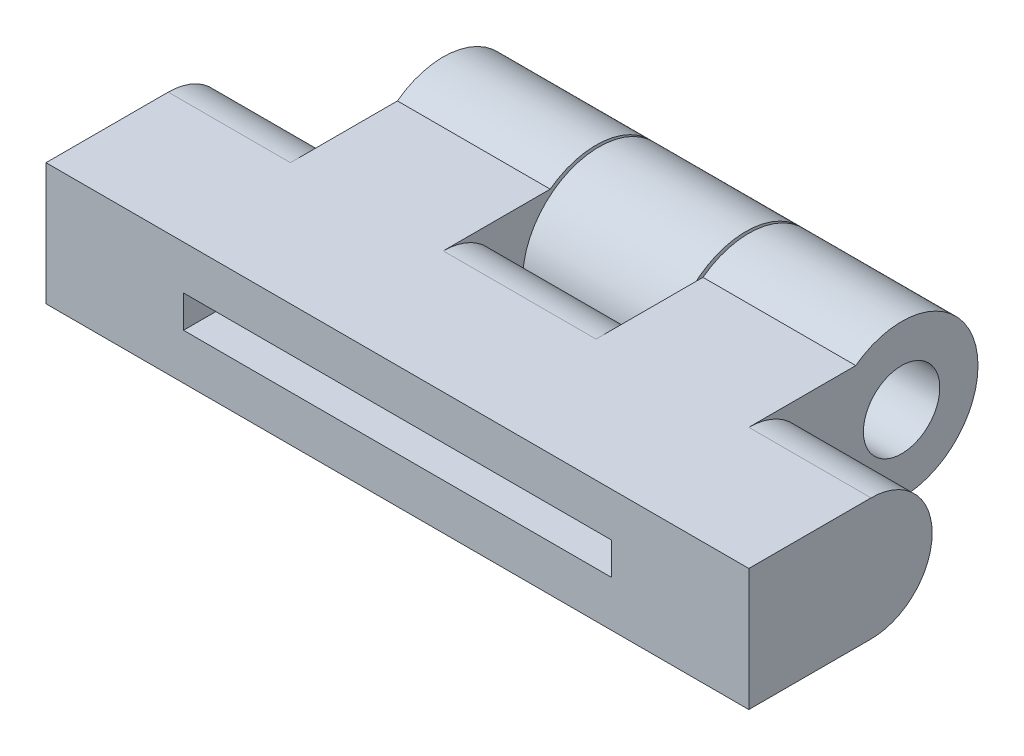
ISO-10303-21;
HEADER;
FILE_DESCRIPTION(('STEP AP214'),'2;1');
FILE_NAME('part.step','',(''),(''),'','','');
FILE_SCHEMA(('AUTOMOTIVE_DESIGN { 1 0 10303 214 1 1 1 1 }'));
ENDSEC;
DATA;
#1=APPLICATION_CONTEXT('core data for automotive mechanical design processes');
#2=APPLICATION_PROTOCOL_DEFINITION('international standard','automotive_design',2000,#1);
#3=PRODUCT_CONTEXT('',#1,'mechanical');
#4=PRODUCT('Part','Part','',(#3));
#5=PRODUCT_RELATED_PRODUCT_CATEGORY('part','',(#4));
#6=PRODUCT_DEFINITION_FORMATION('','',#4);
#7=PRODUCT_DEFINITION_CONTEXT('part definition',#1,'design');
#8=PRODUCT_DEFINITION('design','',#6,#7);
#9=PRODUCT_DEFINITION_SHAPE('','',#8);
#10=(LENGTH_UNIT() NAMED_UNIT(*) SI_UNIT(.MILLI.,.METRE.));
#11=(NAMED_UNIT(*) PLANE_ANGLE_UNIT() SI_UNIT($,.RADIAN.));
#12=(NAMED_UNIT(*) SI_UNIT($,.STERADIAN.) SOLID_ANGLE_UNIT());
#13=UNCERTAINTY_MEASURE_WITH_UNIT(LENGTH_MEASURE(1.E-05),#10,'distance_accuracy_value','');
#14=(GEOMETRIC_REPRESENTATION_CONTEXT(3) GLOBAL_UNCERTAINTY_ASSIGNED_CONTEXT((#13)) GLOBAL_UNIT_ASSIGNED_CONTEXT((#10,
#11,#12)) REPRESENTATION_CONTEXT('',''));
#15=CARTESIAN_POINT('',(0.,0.,0.));
#16=DIRECTION('',(0.,0.,1.));
#17=DIRECTION('',(1.,0.,0.));
#18=AXIS2_PLACEMENT_3D('',#15,#16,#17);
#19=CARTESIAN_POINT('',(139.,20.,-10.));
#20=DIRECTION('',(-1.,0.,0.));
#21=DIRECTION('',(0.,0.,1.));
#22=AXIS2_PLACEMENT_3D('',#19,#20,#21);
#23=CYLINDRICAL_SURFACE('',#22,25.);
#24=CARTESIAN_POINT('',(139.,20.,-10.));
#25=DIRECTION('',(1.,0.,0.));
#26=DIRECTION('',(0.,0.,-1.));
#27=AXIS2_PLACEMENT_3D('',#24,#25,#26);
#28=CIRCLE('',#27,25.);
#29=CARTESIAN_POINT('',(139.,20.,-35.));
#30=VERTEX_POINT('',#29);
#31=EDGE_CURVE('E11',#30,#30,#28,.T.);
#32=ORIENTED_EDGE('',*,*,#31,.F.);
#33=EDGE_LOOP('',(#32));
#34=FACE_BOUND('',#33,.T.);
#35=CARTESIAN_POINT('',(91.,20.,-10.));
#36=DIRECTION('',(1.,0.,0.));
#37=DIRECTION('',(0.,0.,-1.));
#38=AXIS2_PLACEMENT_3D('',#35,#36,#37);
#39=CIRCLE('',#38,25.);
#40=CARTESIAN_POINT('',(91.,20.,-35.));
#41=VERTEX_POINT('',#40);
#42=EDGE_CURVE('E56',#41,#41,#39,.T.);
#43=ORIENTED_EDGE('',*,*,#42,.T.);
#44=EDGE_LOOP('',(#43));
#45=FACE_BOUND('',#44,.T.);
#46=ADVANCED_FACE('F53',(#34,#45),#23,.T.);
#47=CARTESIAN_POINT('',(139.,20.,-10.));
#48=DIRECTION('',(1.,0.,0.));
#49=DIRECTION('',(0.,0.,-1.));
#50=AXIS2_PLACEMENT_3D('',#47,#48,#49);
#51=PLANE('',#50);
#52=CARTESIAN_POINT('',(139.,20.,-10.));
#53=DIRECTION('',(1.,0.,0.));
#54=DIRECTION('',(0.,0.,-1.));
#55=AXIS2_PLACEMENT_3D('',#52,#53,#54);
#56=CIRCLE('',#55,12.5);
#57=CARTESIAN_POINT('',(139.,20.,-22.5));
#58=VERTEX_POINT('',#57);
#59=EDGE_CURVE('E63',#58,#58,#56,.T.);
#60=ORIENTED_EDGE('',*,*,#59,.F.);
#61=EDGE_LOOP('',(#60));
#62=FACE_BOUND('',#61,.T.);
#63=ORIENTED_EDGE('',*,*,#31,.T.);
#64=EDGE_LOOP('',(#63));
#65=FACE_BOUND('',#64,.T.);
#66=ADVANCED_FACE('F74',(#62,#65),#51,.T.);
#67=CARTESIAN_POINT('',(91.,20.,-10.));
#68=DIRECTION('',(1.,0.,0.));
#69=DIRECTION('',(0.,0.,-1.));
#70=AXIS2_PLACEMENT_3D('',#67,#68,#69);
#71=PLANE('',#70);
#72=CARTESIAN_POINT('',(91.,20.,-10.));
#73=DIRECTION('',(1.,0.,0.));
#74=DIRECTION('',(0.,0.,-1.));
#75=AXIS2_PLACEMENT_3D('',#72,#73,#74);
#76=CIRCLE('',#75,12.5);
#77=CARTESIAN_POINT('',(91.,20.,-22.5));
#78=VERTEX_POINT('',#77);
#79=EDGE_CURVE('E65',#78,#78,#76,.T.);
#80=ORIENTED_EDGE('',*,*,#79,.T.);
#81=EDGE_LOOP('',(#80));
#82=FACE_BOUND('',#81,.T.);
#83=ORIENTED_EDGE('',*,*,#42,.F.);
#84=EDGE_LOOP('',(#83));
#85=FACE_BOUND('',#84,.T.);
#86=ADVANCED_FACE('F76',(#82,#85),#71,.F.);
#87=CARTESIAN_POINT('',(139.,20.,-10.));
#88=DIRECTION('',(-1.,0.,0.));
#89=DIRECTION('',(0.,0.,1.));
#90=AXIS2_PLACEMENT_3D('',#87,#88,#89);
#91=CYLINDRICAL_SURFACE('',#90,12.5);
#92=ORIENTED_EDGE('',*,*,#59,.T.);
#93=EDGE_LOOP('',(#92));
#94=FACE_BOUND('',#93,.T.);
#95=ORIENTED_EDGE('',*,*,#79,.F.);
#96=EDGE_LOOP('',(#95));
#97=FACE_BOUND('',#96,.T.);
#98=ADVANCED_FACE('F71',(#94,#97),#91,.F.);
#99=CLOSED_SHELL('',(#46,#66,#86,#98));
#100=MANIFOLD_SOLID_BREP('B2',#99);
#101=CARTESIAN_POINT('',(0.,0.,80.));
#102=DIRECTION('',(0.,1.,0.));
#103=DIRECTION('',(0.,0.,1.));
#104=AXIS2_PLACEMENT_3D('',#101,#102,#103);
#105=PLANE('',#104);
#106=DIRECTION('',(0.,0.,-1.));
#107=VECTOR('',#106,1.);
#108=CARTESIAN_POINT('',(0.,0.,80.));
#109=LINE('',#108,#107);
#110=CARTESIAN_POINT('',(0.,0.,80.));
#111=VERTEX_POINT('',#110);
#112=CARTESIAN_POINT('',(0.,0.,40.));
#113=VERTEX_POINT('',#112);
#114=EDGE_CURVE('E280',#111,#113,#109,.T.);
#115=ORIENTED_EDGE('',*,*,#114,.T.);
#116=DIRECTION('',(1.,0.,0.));
#117=VECTOR('',#116,1.);
#118=CARTESIAN_POINT('',(0.,0.,40.));
#119=LINE('',#118,#117);
#120=CARTESIAN_POINT('',(40.,0.,40.));
#121=VERTEX_POINT('',#120);
#122=EDGE_CURVE('E337',#113,#121,#119,.T.);
#123=ORIENTED_EDGE('',*,*,#122,.T.);
#124=DIRECTION('',(0.,0.,1.));
#125=VECTOR('',#124,1.);
#126=CARTESIAN_POINT('',(40.,0.,80.));
#127=LINE('',#126,#125);
#128=CARTESIAN_POINT('',(40.,0.,5.00000000000002));
#129=VERTEX_POINT('',#128);
#130=EDGE_CURVE('E135',#129,#121,#127,.T.);
#131=ORIENTED_EDGE('',*,*,#130,.F.);
#132=DIRECTION('',(1.,0.,0.));
#133=VECTOR('',#132,1.);
#134=CARTESIAN_POINT('',(40.,0.,5.00000000000002));
#135=LINE('',#134,#133);
#136=CARTESIAN_POINT('',(90.,0.,5.00000000000002));
#137=VERTEX_POINT('',#136);
#138=EDGE_CURVE('E264',#129,#137,#135,.T.);
#139=ORIENTED_EDGE('',*,*,#138,.T.);
#140=DIRECTION('',(0.,0.,-1.));
#141=VECTOR('',#140,1.);
#142=CARTESIAN_POINT('',(90.,0.,80.));
#143=LINE('',#142,#141);
#144=CARTESIAN_POINT('',(90.,0.,40.));
#145=VERTEX_POINT('',#144);
#146=EDGE_CURVE('E491',#145,#137,#143,.T.);
#147=ORIENTED_EDGE('',*,*,#146,.F.);
#148=DIRECTION('',(-1.,0.,0.));
#149=VECTOR('',#148,1.);
#150=CARTESIAN_POINT('',(140.,0.,40.));
#151=LINE('',#150,#149);
#152=CARTESIAN_POINT('',(140.,0.,40.));
#153=VERTEX_POINT('',#152);
#154=EDGE_CURVE('E277',#145,#153,#151,.F.);
#155=ORIENTED_EDGE('',*,*,#154,.T.);
#156=DIRECTION('',(0.,0.,1.));
#157=VECTOR('',#156,1.);
#158=CARTESIAN_POINT('',(140.,0.,80.));
#159=LINE('',#158,#157);
#160=CARTESIAN_POINT('',(140.,0.,5.00000000000002));
#161=VERTEX_POINT('',#160);
#162=EDGE_CURVE('E462',#161,#153,#159,.T.);
#163=ORIENTED_EDGE('',*,*,#162,.F.);
#164=DIRECTION('',(-1.,0.,0.));
#165=VECTOR('',#164,1.);
#166=CARTESIAN_POINT('',(190.,0.,5.00000000000002));
#167=LINE('',#166,#165);
#168=CARTESIAN_POINT('',(190.,0.,5.00000000000002));
#169=VERTEX_POINT('',#168);
#170=EDGE_CURVE('E431',#169,#161,#167,.T.);
#171=ORIENTED_EDGE('',*,*,#170,.F.);
#172=DIRECTION('',(0.,0.,-1.));
#173=VECTOR('',#172,1.);
#174=CARTESIAN_POINT('',(190.,0.,80.));
#175=LINE('',#174,#173);
#176=CARTESIAN_POINT('',(190.,0.,40.));
#177=VERTEX_POINT('',#176);
#178=EDGE_CURVE('E474',#177,#169,#175,.T.);
#179=ORIENTED_EDGE('',*,*,#178,.F.);
#180=DIRECTION('',(1.,0.,0.));
#181=VECTOR('',#180,1.);
#182=CARTESIAN_POINT('',(0.,0.,40.));
#183=LINE('',#182,#181);
#184=CARTESIAN_POINT('',(230.,0.,40.));
#185=VERTEX_POINT('',#184);
#186=EDGE_CURVE('E315',#177,#185,#183,.T.);
#187=ORIENTED_EDGE('',*,*,#186,.T.);
#188=DIRECTION('',(0.,0.,-1.));
#189=VECTOR('',#188,1.);
#190=CARTESIAN_POINT('',(230.,0.,80.));
#191=LINE('',#190,#189);
#192=CARTESIAN_POINT('',(230.,0.,80.));
#193=VERTEX_POINT('',#192);
#194=EDGE_CURVE('E367',#193,#185,#191,.T.);
#195=ORIENTED_EDGE('',*,*,#194,.F.);
#196=DIRECTION('',(1.,0.,0.));
#197=VECTOR('',#196,1.);
#198=CARTESIAN_POINT('',(0.,0.,80.));
#199=LINE('',#198,#197);
#200=EDGE_CURVE('E394',#111,#193,#199,.T.);
#201=ORIENTED_EDGE('',*,*,#200,.F.);
#202=EDGE_LOOP('',(#115,#123,#131,#139,#147,#155,#163,#171,#179,#187,#195,#201));
#203=FACE_BOUND('',#202,.T.);
#204=ADVANCED_FACE('F115',(#203),#105,.F.);
#205=CARTESIAN_POINT('',(0.,40.,80.));
#206=DIRECTION('',(0.,-1.,0.));
#207=DIRECTION('',(0.,0.,-1.));
#208=AXIS2_PLACEMENT_3D('',#205,#206,#207);
#209=PLANE('',#208);
#210=DIRECTION('',(0.,0.,-1.));
#211=VECTOR('',#210,1.);
#212=CARTESIAN_POINT('',(40.,40.,80.));
#213=LINE('',#212,#211);
#214=CARTESIAN_POINT('',(40.,40.,40.));
#215=VERTEX_POINT('',#214);
#216=CARTESIAN_POINT('',(40.,40.,5.00000000000002));
#217=VERTEX_POINT('',#216);
#218=EDGE_CURVE('E243',#215,#217,#213,.T.);
#219=ORIENTED_EDGE('',*,*,#218,.F.);
#220=DIRECTION('',(1.,0.,0.));
#221=VECTOR('',#220,1.);
#222=CARTESIAN_POINT('',(0.,40.,40.));
#223=LINE('',#222,#221);
#224=CARTESIAN_POINT('',(0.,40.,40.));
#225=VERTEX_POINT('',#224);
#226=EDGE_CURVE('E325',#215,#225,#223,.F.);
#227=ORIENTED_EDGE('',*,*,#226,.T.);
#228=DIRECTION('',(0.,0.,-1.));
#229=VECTOR('',#228,1.);
#230=CARTESIAN_POINT('',(0.,40.,80.));
#231=LINE('',#230,#229);
#232=CARTESIAN_POINT('',(0.,40.,80.));
#233=VERTEX_POINT('',#232);
#234=EDGE_CURVE('E354',#233,#225,#231,.T.);
#235=ORIENTED_EDGE('',*,*,#234,.F.);
#236=DIRECTION('',(-1.,0.,0.));
#237=VECTOR('',#236,1.);
#238=CARTESIAN_POINT('',(0.,40.,80.));
#239=LINE('',#238,#237);
#240=CARTESIAN_POINT('',(230.,40.,80.));
#241=VERTEX_POINT('',#240);
#242=EDGE_CURVE('E362',#241,#233,#239,.T.);
#243=ORIENTED_EDGE('',*,*,#242,.F.);
#244=DIRECTION('',(0.,0.,-1.));
#245=VECTOR('',#244,1.);
#246=CARTESIAN_POINT('',(230.,40.,80.));
#247=LINE('',#246,#245);
#248=CARTESIAN_POINT('',(230.,40.,40.));
#249=VERTEX_POINT('',#248);
#250=EDGE_CURVE('E361',#241,#249,#247,.T.);
#251=ORIENTED_EDGE('',*,*,#250,.T.);
#252=DIRECTION('',(1.,0.,0.));
#253=VECTOR('',#252,1.);
#254=CARTESIAN_POINT('',(0.,40.,40.));
#255=LINE('',#254,#253);
#256=CARTESIAN_POINT('',(190.,40.,40.));
#257=VERTEX_POINT('',#256);
#258=EDGE_CURVE('E311',#249,#257,#255,.F.);
#259=ORIENTED_EDGE('',*,*,#258,.T.);
#260=DIRECTION('',(0.,0.,1.));
#261=VECTOR('',#260,1.);
#262=CARTESIAN_POINT('',(190.,40.,80.));
#263=LINE('',#262,#261);
#264=CARTESIAN_POINT('',(190.,40.,5.00000000000002));
#265=VERTEX_POINT('',#264);
#266=EDGE_CURVE('E471',#265,#257,#263,.T.);
#267=ORIENTED_EDGE('',*,*,#266,.F.);
#268=DIRECTION('',(-1.,0.,0.));
#269=VECTOR('',#268,1.);
#270=CARTESIAN_POINT('',(190.,40.,5.00000000000002));
#271=LINE('',#270,#269);
#272=CARTESIAN_POINT('',(140.,40.,5.00000000000002));
#273=VERTEX_POINT('',#272);
#274=EDGE_CURVE('E273',#273,#265,#271,.F.);
#275=ORIENTED_EDGE('',*,*,#274,.F.);
#276=DIRECTION('',(0.,0.,-1.));
#277=VECTOR('',#276,1.);
#278=CARTESIAN_POINT('',(140.,40.,80.));
#279=LINE('',#278,#277);
#280=CARTESIAN_POINT('',(140.,40.,40.));
#281=VERTEX_POINT('',#280);
#282=EDGE_CURVE('E468',#281,#273,#279,.T.);
#283=ORIENTED_EDGE('',*,*,#282,.F.);
#284=DIRECTION('',(-1.,0.,0.));
#285=VECTOR('',#284,1.);
#286=CARTESIAN_POINT('',(90.,40.,40.));
#287=LINE('',#286,#285);
#288=CARTESIAN_POINT('',(90.,40.,40.));
#289=VERTEX_POINT('',#288);
#290=EDGE_CURVE('E272',#281,#289,#287,.T.);
#291=ORIENTED_EDGE('',*,*,#290,.T.);
#292=DIRECTION('',(0.,0.,1.));
#293=VECTOR('',#292,1.);
#294=CARTESIAN_POINT('',(90.,40.,80.));
#295=LINE('',#294,#293);
#296=CARTESIAN_POINT('',(90.,40.,5.00000000000002));
#297=VERTEX_POINT('',#296);
#298=EDGE_CURVE('E270',#297,#289,#295,.T.);
#299=ORIENTED_EDGE('',*,*,#298,.F.);
#300=DIRECTION('',(1.,0.,0.));
#301=VECTOR('',#300,1.);
#302=CARTESIAN_POINT('',(40.,40.,5.00000000000002));
#303=LINE('',#302,#301);
#304=EDGE_CURVE('E261',#297,#217,#303,.F.);
#305=ORIENTED_EDGE('',*,*,#304,.T.);
#306=EDGE_LOOP('',(#219,#227,#235,#243,#251,#259,#267,#275,#283,#291,#299,#305));
#307=FACE_BOUND('',#306,.T.);
#308=ADVANCED_FACE('F268',(#307),#209,.F.);
#309=CARTESIAN_POINT('',(0.,0.,80.));
#310=DIRECTION('',(1.,0.,0.));
#311=DIRECTION('',(0.,0.,-1.));
#312=AXIS2_PLACEMENT_3D('',#309,#310,#311);
#313=PLANE('',#312);
#314=ORIENTED_EDGE('',*,*,#234,.T.);
#315=CARTESIAN_POINT('',(0.,20.,40.));
#316=DIRECTION('',(1.,0.,0.));
#317=DIRECTION('',(0.,0.,-1.));
#318=AXIS2_PLACEMENT_3D('',#315,#316,#317);
#319=CIRCLE('',#318,20.);
#320=CARTESIAN_POINT('',(0.,20.,20.));
#321=VERTEX_POINT('',#320);
#322=EDGE_CURVE('E334',#225,#321,#319,.F.);
#323=ORIENTED_EDGE('',*,*,#322,.T.);
#324=CARTESIAN_POINT('',(0.,20.,40.));
#325=DIRECTION('',(1.,0.,0.));
#326=DIRECTION('',(0.,0.,-1.));
#327=AXIS2_PLACEMENT_3D('',#324,#325,#326);
#328=CIRCLE('',#327,20.);
#329=EDGE_CURVE('E331',#321,#113,#328,.F.);
#330=ORIENTED_EDGE('',*,*,#329,.T.);
#331=ORIENTED_EDGE('',*,*,#114,.F.);
#332=DIRECTION('',(0.,-1.,0.));
#333=VECTOR('',#332,1.);
#334=CARTESIAN_POINT('',(0.,0.,80.));
#335=LINE('',#334,#333);
#336=EDGE_CURVE('E359',#233,#111,#335,.T.);
#337=ORIENTED_EDGE('',*,*,#336,.F.);
#338=EDGE_LOOP('',(#314,#323,#330,#331,#337));
#339=FACE_BOUND('',#338,.T.);
#340=ADVANCED_FACE('F357',(#339),#313,.F.);
#341=CARTESIAN_POINT('',(230.,0.,80.));
#342=DIRECTION('',(-1.,0.,0.));
#343=DIRECTION('',(0.,0.,1.));
#344=AXIS2_PLACEMENT_3D('',#341,#342,#343);
#345=PLANE('',#344);
#346=CARTESIAN_POINT('',(230.,20.,40.));
#347=DIRECTION('',(-1.,0.,0.));
#348=DIRECTION('',(0.,0.,1.));
#349=AXIS2_PLACEMENT_3D('',#346,#347,#348);
#350=CIRCLE('',#349,20.);
#351=CARTESIAN_POINT('',(230.,20.,20.));
#352=VERTEX_POINT('',#351);
#353=EDGE_CURVE('E301',#185,#352,#350,.F.);
#354=ORIENTED_EDGE('',*,*,#353,.T.);
#355=CARTESIAN_POINT('',(230.,20.,40.));
#356=DIRECTION('',(-1.,0.,0.));
#357=DIRECTION('',(0.,0.,1.));
#358=AXIS2_PLACEMENT_3D('',#355,#356,#357);
#359=CIRCLE('',#358,20.);
#360=EDGE_CURVE('E308',#352,#249,#359,.F.);
#361=ORIENTED_EDGE('',*,*,#360,.T.);
#362=ORIENTED_EDGE('',*,*,#250,.F.);
#363=DIRECTION('',(0.,1.,0.));
#364=VECTOR('',#363,1.);
#365=CARTESIAN_POINT('',(230.,0.,80.));
#366=LINE('',#365,#364);
#367=EDGE_CURVE('E369',#193,#241,#366,.T.);
#368=ORIENTED_EDGE('',*,*,#367,.F.);
#369=ORIENTED_EDGE('',*,*,#194,.T.);
#370=EDGE_LOOP('',(#354,#361,#362,#368,#369));
#371=FACE_BOUND('',#370,.T.);
#372=ADVANCED_FACE('F380',(#371),#345,.F.);
#373=CARTESIAN_POINT('',(0.,0.,80.));
#374=DIRECTION('',(0.,0.,-1.));
#375=DIRECTION('',(-1.,0.,0.));
#376=AXIS2_PLACEMENT_3D('',#373,#374,#375);
#377=PLANE('',#376);
#378=DIRECTION('',(-1.,0.,0.));
#379=VECTOR('',#378,1.);
#380=CARTESIAN_POINT('',(45.,25.5870827322945,80.));
#381=LINE('',#380,#379);
#382=CARTESIAN_POINT('',(185.,25.5870827322945,80.));
#383=VERTEX_POINT('',#382);
#384=CARTESIAN_POINT('',(45.,25.5870827322945,80.));
#385=VERTEX_POINT('',#384);
#386=EDGE_CURVE('E424',#383,#385,#381,.T.);
#387=ORIENTED_EDGE('',*,*,#386,.F.);
#388=DIRECTION('',(0.,1.,0.));
#389=VECTOR('',#388,1.);
#390=CARTESIAN_POINT('',(185.,25.5870827322945,80.));
#391=LINE('',#390,#389);
#392=CARTESIAN_POINT('',(185.,15.,80.));
#393=VERTEX_POINT('',#392);
#394=EDGE_CURVE('E428',#393,#383,#391,.T.);
#395=ORIENTED_EDGE('',*,*,#394,.F.);
#396=DIRECTION('',(1.,0.,0.));
#397=VECTOR('',#396,1.);
#398=CARTESIAN_POINT('',(45.,15.,80.));
#399=LINE('',#398,#397);
#400=CARTESIAN_POINT('',(45.,15.,80.));
#401=VERTEX_POINT('',#400);
#402=EDGE_CURVE('E415',#401,#393,#399,.T.);
#403=ORIENTED_EDGE('',*,*,#402,.F.);
#404=DIRECTION('',(0.,-1.,0.));
#405=VECTOR('',#404,1.);
#406=CARTESIAN_POINT('',(45.,25.5870827322945,80.));
#407=LINE('',#406,#405);
#408=EDGE_CURVE('E420',#385,#401,#407,.T.);
#409=ORIENTED_EDGE('',*,*,#408,.F.);
#410=EDGE_LOOP('',(#387,#395,#403,#409));
#411=FACE_BOUND('',#410,.T.);
#412=ORIENTED_EDGE('',*,*,#336,.T.);
#413=ORIENTED_EDGE('',*,*,#200,.T.);
#414=ORIENTED_EDGE('',*,*,#367,.T.);
#415=ORIENTED_EDGE('',*,*,#242,.T.);
#416=EDGE_LOOP('',(#412,#413,#414,#415));
#417=FACE_BOUND('',#416,.T.);
#418=ADVANCED_FACE('F393',(#411,#417),#377,.F.);
#419=CARTESIAN_POINT('',(185.,25.5870827322945,40.));
#420=DIRECTION('',(1.,0.,0.));
#421=DIRECTION('',(0.,0.,-1.));
#422=AXIS2_PLACEMENT_3D('',#419,#420,#421);
#423=PLANE('',#422);
#424=ORIENTED_EDGE('',*,*,#394,.T.);
#425=DIRECTION('',(0.,0.,1.));
#426=VECTOR('',#425,1.);
#427=CARTESIAN_POINT('',(185.,25.5870827322945,40.));
#428=LINE('',#427,#426);
#429=CARTESIAN_POINT('',(185.,25.5870827322945,40.));
#430=VERTEX_POINT('',#429);
#431=EDGE_CURVE('E402',#430,#383,#428,.T.);
#432=ORIENTED_EDGE('',*,*,#431,.F.);
#433=DIRECTION('',(0.,1.,0.));
#434=VECTOR('',#433,1.);
#435=CARTESIAN_POINT('',(185.,25.5870827322945,40.));
#436=LINE('',#435,#434);
#437=CARTESIAN_POINT('',(185.,15.,40.));
#438=VERTEX_POINT('',#437);
#439=EDGE_CURVE('E419',#438,#430,#436,.T.);
#440=ORIENTED_EDGE('',*,*,#439,.F.);
#441=DIRECTION('',(0.,0.,1.));
#442=VECTOR('',#441,1.);
#443=CARTESIAN_POINT('',(185.,15.,40.));
#444=LINE('',#443,#442);
#445=EDGE_CURVE('E401',#438,#393,#444,.T.);
#446=ORIENTED_EDGE('',*,*,#445,.T.);
#447=EDGE_LOOP('',(#424,#432,#440,#446));
#448=FACE_BOUND('',#447,.T.);
#449=ADVANCED_FACE('F657',(#448),#423,.F.);
#450=CARTESIAN_POINT('',(45.,15.,40.));
#451=DIRECTION('',(0.,-1.,0.));
#452=DIRECTION('',(0.,0.,-1.));
#453=AXIS2_PLACEMENT_3D('',#450,#451,#452);
#454=PLANE('',#453);
#455=ORIENTED_EDGE('',*,*,#402,.T.);
#456=ORIENTED_EDGE('',*,*,#445,.F.);
#457=DIRECTION('',(1.,0.,0.));
#458=VECTOR('',#457,1.);
#459=CARTESIAN_POINT('',(45.,15.,40.));
#460=LINE('',#459,#458);
#461=CARTESIAN_POINT('',(45.,15.,40.));
#462=VERTEX_POINT('',#461);
#463=EDGE_CURVE('E407',#462,#438,#460,.T.);
#464=ORIENTED_EDGE('',*,*,#463,.F.);
#465=DIRECTION('',(0.,0.,1.));
#466=VECTOR('',#465,1.);
#467=CARTESIAN_POINT('',(45.,15.,40.));
#468=LINE('',#467,#466);
#469=EDGE_CURVE('E410',#462,#401,#468,.T.);
#470=ORIENTED_EDGE('',*,*,#469,.T.);
#471=EDGE_LOOP('',(#455,#456,#464,#470));
#472=FACE_BOUND('',#471,.T.);
#473=ADVANCED_FACE('F667',(#472),#454,.F.);
#474=CARTESIAN_POINT('',(45.,25.5870827322945,40.));
#475=DIRECTION('',(-1.,0.,0.));
#476=DIRECTION('',(0.,0.,1.));
#477=AXIS2_PLACEMENT_3D('',#474,#475,#476);
#478=PLANE('',#477);
#479=ORIENTED_EDGE('',*,*,#408,.T.);
#480=ORIENTED_EDGE('',*,*,#469,.F.);
#481=DIRECTION('',(0.,-1.,0.));
#482=VECTOR('',#481,1.);
#483=CARTESIAN_POINT('',(45.,25.5870827322945,40.));
#484=LINE('',#483,#482);
#485=CARTESIAN_POINT('',(45.,25.5870827322945,40.));
#486=VERTEX_POINT('',#485);
#487=EDGE_CURVE('E435',#486,#462,#484,.T.);
#488=ORIENTED_EDGE('',*,*,#487,.F.);
#489=DIRECTION('',(0.,0.,1.));
#490=VECTOR('',#489,1.);
#491=CARTESIAN_POINT('',(45.,25.5870827322945,40.));
#492=LINE('',#491,#490);
#493=EDGE_CURVE('E406',#486,#385,#492,.T.);
#494=ORIENTED_EDGE('',*,*,#493,.T.);
#495=EDGE_LOOP('',(#479,#480,#488,#494));
#496=FACE_BOUND('',#495,.T.);
#497=ADVANCED_FACE('F677',(#496),#478,.F.);
#498=CARTESIAN_POINT('',(45.,25.5870827322945,40.));
#499=DIRECTION('',(0.,1.,0.));
#500=DIRECTION('',(0.,0.,1.));
#501=AXIS2_PLACEMENT_3D('',#498,#499,#500);
#502=PLANE('',#501);
#503=ORIENTED_EDGE('',*,*,#386,.T.);
#504=ORIENTED_EDGE('',*,*,#493,.F.);
#505=DIRECTION('',(-1.,0.,0.));
#506=VECTOR('',#505,1.);
#507=CARTESIAN_POINT('',(45.,25.5870827322945,40.));
#508=LINE('',#507,#506);
#509=EDGE_CURVE('E439',#430,#486,#508,.T.);
#510=ORIENTED_EDGE('',*,*,#509,.F.);
#511=ORIENTED_EDGE('',*,*,#431,.T.);
#512=EDGE_LOOP('',(#503,#504,#510,#511));
#513=FACE_BOUND('',#512,.T.);
#514=ADVANCED_FACE('F687',(#513),#502,.F.);
#515=CARTESIAN_POINT('',(0.,0.,40.));
#516=DIRECTION('',(0.,0.,1.));
#517=DIRECTION('',(1.,0.,0.));
#518=AXIS2_PLACEMENT_3D('',#515,#516,#517);
#519=PLANE('',#518);
#520=ORIENTED_EDGE('',*,*,#439,.T.);
#521=ORIENTED_EDGE('',*,*,#509,.T.);
#522=ORIENTED_EDGE('',*,*,#487,.T.);
#523=ORIENTED_EDGE('',*,*,#463,.T.);
#524=EDGE_LOOP('',(#520,#521,#522,#523));
#525=FACE_BOUND('',#524,.T.);
#526=ADVANCED_FACE('F697',(#525),#519,.T.);
#527=CARTESIAN_POINT('',(190.,20.,-10.));
#528=DIRECTION('',(-1.,0.,0.));
#529=DIRECTION('',(0.,0.,1.));
#530=AXIS2_PLACEMENT_3D('',#527,#528,#529);
#531=CYLINDRICAL_SURFACE('',#530,25.);
#532=CARTESIAN_POINT('',(190.,20.,-10.));
#533=DIRECTION('',(1.,0.,0.));
#534=DIRECTION('',(0.,0.,-1.));
#535=AXIS2_PLACEMENT_3D('',#532,#533,#534);
#536=CIRCLE('',#535,25.);
#537=EDGE_CURVE('E449',#169,#265,#536,.T.);
#538=ORIENTED_EDGE('',*,*,#537,.F.);
#539=ORIENTED_EDGE('',*,*,#170,.T.);
#540=CARTESIAN_POINT('',(140.,20.,-10.));
#541=DIRECTION('',(1.,0.,0.));
#542=DIRECTION('',(0.,0.,-1.));
#543=AXIS2_PLACEMENT_3D('',#540,#541,#542);
#544=CIRCLE('',#543,25.);
#545=EDGE_CURVE('E450',#161,#273,#544,.T.);
#546=ORIENTED_EDGE('',*,*,#545,.T.);
#547=ORIENTED_EDGE('',*,*,#274,.T.);
#548=EDGE_LOOP('',(#538,#539,#546,#547));
#549=FACE_BOUND('',#548,.T.);
#550=ADVANCED_FACE('F514',(#549),#531,.T.);
#551=CARTESIAN_POINT('',(190.,20.,-10.));
#552=DIRECTION('',(1.,0.,0.));
#553=DIRECTION('',(0.,0.,-1.));
#554=AXIS2_PLACEMENT_3D('',#551,#552,#553);
#555=PLANE('',#554);
#556=ORIENTED_EDGE('',*,*,#266,.T.);
#557=CARTESIAN_POINT('',(190.,20.,40.));
#558=DIRECTION('',(1.,0.,0.));
#559=DIRECTION('',(0.,0.,-1.));
#560=AXIS2_PLACEMENT_3D('',#557,#558,#559);
#561=CIRCLE('',#560,20.);
#562=CARTESIAN_POINT('',(190.,20.,20.));
#563=VERTEX_POINT('',#562);
#564=EDGE_CURVE('E318',#257,#563,#561,.F.);
#565=ORIENTED_EDGE('',*,*,#564,.T.);
#566=CARTESIAN_POINT('',(190.,20.,40.));
#567=DIRECTION('',(1.,0.,0.));
#568=DIRECTION('',(0.,0.,-1.));
#569=AXIS2_PLACEMENT_3D('',#566,#567,#568);
#570=CIRCLE('',#569,20.);
#571=EDGE_CURVE('E321',#563,#177,#570,.F.);
#572=ORIENTED_EDGE('',*,*,#571,.T.);
#573=ORIENTED_EDGE('',*,*,#178,.T.);
#574=ORIENTED_EDGE('',*,*,#537,.T.);
#575=EDGE_LOOP('',(#556,#565,#572,#573,#574));
#576=FACE_BOUND('',#575,.T.);
#577=CARTESIAN_POINT('',(190.,20.,-10.));
#578=DIRECTION('',(-1.,0.,0.));
#579=DIRECTION('',(0.,0.,1.));
#580=AXIS2_PLACEMENT_3D('',#577,#578,#579);
#581=CIRCLE('',#580,12.5);
#582=CARTESIAN_POINT('',(190.,20.,2.5));
#583=VERTEX_POINT('',#582);
#584=EDGE_CURVE('E454',#583,#583,#581,.T.);
#585=ORIENTED_EDGE('',*,*,#584,.T.);
#586=EDGE_LOOP('',(#585));
#587=FACE_BOUND('',#586,.T.);
#588=ADVANCED_FACE('F516',(#576,#587),#555,.T.);
#589=CARTESIAN_POINT('',(140.,20.,-10.));
#590=DIRECTION('',(1.,0.,0.));
#591=DIRECTION('',(0.,0.,-1.));
#592=AXIS2_PLACEMENT_3D('',#589,#590,#591);
#593=PLANE('',#592);
#594=ORIENTED_EDGE('',*,*,#162,.T.);
#595=CARTESIAN_POINT('',(140.,20.,40.));
#596=DIRECTION('',(1.,0.,0.));
#597=DIRECTION('',(0.,0.,-1.));
#598=AXIS2_PLACEMENT_3D('',#595,#596,#597);
#599=CIRCLE('',#598,20.);
#600=CARTESIAN_POINT('',(140.,20.,20.));
#601=VERTEX_POINT('',#600);
#602=EDGE_CURVE('E298',#153,#601,#599,.T.);
#603=ORIENTED_EDGE('',*,*,#602,.T.);
#604=CARTESIAN_POINT('',(140.,20.,40.));
#605=DIRECTION('',(1.,0.,0.));
#606=DIRECTION('',(0.,0.,-1.));
#607=AXIS2_PLACEMENT_3D('',#604,#605,#606);
#608=CIRCLE('',#607,20.);
#609=EDGE_CURVE('E290',#601,#281,#608,.T.);
#610=ORIENTED_EDGE('',*,*,#609,.T.);
#611=ORIENTED_EDGE('',*,*,#282,.T.);
#612=ORIENTED_EDGE('',*,*,#545,.F.);
#613=EDGE_LOOP('',(#594,#603,#610,#611,#612));
#614=FACE_BOUND('',#613,.T.);
#615=CARTESIAN_POINT('',(140.,20.,-10.));
#616=DIRECTION('',(-1.,0.,0.));
#617=DIRECTION('',(0.,0.,1.));
#618=AXIS2_PLACEMENT_3D('',#615,#616,#617);
#619=CIRCLE('',#618,12.5);
#620=CARTESIAN_POINT('',(140.,20.,2.5));
#621=VERTEX_POINT('',#620);
#622=EDGE_CURVE('E458',#621,#621,#619,.T.);
#623=ORIENTED_EDGE('',*,*,#622,.F.);
#624=EDGE_LOOP('',(#623));
#625=FACE_BOUND('',#624,.T.);
#626=ADVANCED_FACE('F507',(#614,#625),#593,.F.);
#627=CARTESIAN_POINT('',(190.,20.,-10.));
#628=DIRECTION('',(-1.,0.,0.));
#629=DIRECTION('',(0.,0.,1.));
#630=AXIS2_PLACEMENT_3D('',#627,#628,#629);
#631=CYLINDRICAL_SURFACE('',#630,12.5);
#632=ORIENTED_EDGE('',*,*,#584,.F.);
#633=EDGE_LOOP('',(#632));
#634=FACE_BOUND('',#633,.T.);
#635=ORIENTED_EDGE('',*,*,#622,.T.);
#636=EDGE_LOOP('',(#635));
#637=FACE_BOUND('',#636,.T.);
#638=ADVANCED_FACE('F522',(#634,#637),#631,.F.);
#639=CARTESIAN_POINT('',(40.,20.,-10.));
#640=DIRECTION('',(1.,0.,0.));
#641=DIRECTION('',(0.,0.,-1.));
#642=AXIS2_PLACEMENT_3D('',#639,#640,#641);
#643=CYLINDRICAL_SURFACE('',#642,25.);
#644=ORIENTED_EDGE('',*,*,#138,.F.);
#645=CARTESIAN_POINT('',(40.,20.,-10.));
#646=DIRECTION('',(1.,0.,0.));
#647=DIRECTION('',(0.,0.,-1.));
#648=AXIS2_PLACEMENT_3D('',#645,#646,#647);
#649=CIRCLE('',#648,25.);
#650=EDGE_CURVE('E247',#129,#217,#649,.T.);
#651=ORIENTED_EDGE('',*,*,#650,.T.);
#652=ORIENTED_EDGE('',*,*,#304,.F.);
#653=CARTESIAN_POINT('',(90.,20.,-10.));
#654=DIRECTION('',(1.,0.,0.));
#655=DIRECTION('',(0.,0.,-1.));
#656=AXIS2_PLACEMENT_3D('',#653,#654,#655);
#657=CIRCLE('',#656,25.);
#658=EDGE_CURVE('E266',#137,#297,#657,.T.);
#659=ORIENTED_EDGE('',*,*,#658,.F.);
#660=EDGE_LOOP('',(#644,#651,#652,#659));
#661=FACE_BOUND('',#660,.T.);
#662=ADVANCED_FACE('F259',(#661),#643,.T.);
#663=CARTESIAN_POINT('',(40.,20.,-10.));
#664=DIRECTION('',(-1.,0.,0.));
#665=DIRECTION('',(0.,0.,-1.));
#666=AXIS2_PLACEMENT_3D('',#663,#664,#665);
#667=PLANE('',#666);
#668=ORIENTED_EDGE('',*,*,#130,.T.);
#669=CARTESIAN_POINT('',(40.,20.,40.));
#670=DIRECTION('',(-1.,0.,0.));
#671=DIRECTION('',(0.,0.,1.));
#672=AXIS2_PLACEMENT_3D('',#669,#670,#671);
#673=CIRCLE('',#672,20.);
#674=CARTESIAN_POINT('',(40.,20.,20.));
#675=VERTEX_POINT('',#674);
#676=EDGE_CURVE('E51',#121,#675,#673,.F.);
#677=ORIENTED_EDGE('',*,*,#676,.T.);
#678=CARTESIAN_POINT('',(40.,20.,40.));
#679=DIRECTION('',(-1.,0.,0.));
#680=DIRECTION('',(0.,0.,1.));
#681=AXIS2_PLACEMENT_3D('',#678,#679,#680);
#682=CIRCLE('',#681,20.);
#683=EDGE_CURVE('E125',#675,#215,#682,.F.);
#684=ORIENTED_EDGE('',*,*,#683,.T.);
#685=ORIENTED_EDGE('',*,*,#218,.T.);
#686=ORIENTED_EDGE('',*,*,#650,.F.);
#687=EDGE_LOOP('',(#668,#677,#684,#685,#686));
#688=FACE_BOUND('',#687,.T.);
#689=CARTESIAN_POINT('',(40.,20.,-10.));
#690=DIRECTION('',(-1.,0.,0.));
#691=DIRECTION('',(0.,0.,1.));
#692=AXIS2_PLACEMENT_3D('',#689,#690,#691);
#693=CIRCLE('',#692,12.5);
#694=CARTESIAN_POINT('',(40.,20.,2.5));
#695=VERTEX_POINT('',#694);
#696=EDGE_CURVE('E480',#695,#695,#693,.T.);
#697=ORIENTED_EDGE('',*,*,#696,.F.);
#698=EDGE_LOOP('',(#697));
#699=FACE_BOUND('',#698,.T.);
#700=ADVANCED_FACE('F245',(#688,#699),#667,.T.);
#701=CARTESIAN_POINT('',(90.,20.,-10.));
#702=DIRECTION('',(-1.,0.,0.));
#703=DIRECTION('',(0.,0.,-1.));
#704=AXIS2_PLACEMENT_3D('',#701,#702,#703);
#705=PLANE('',#704);
#706=ORIENTED_EDGE('',*,*,#298,.T.);
#707=CARTESIAN_POINT('',(90.,20.,40.));
#708=DIRECTION('',(-1.,0.,0.));
#709=DIRECTION('',(0.,0.,1.));
#710=AXIS2_PLACEMENT_3D('',#707,#708,#709);
#711=CIRCLE('',#710,20.);
#712=CARTESIAN_POINT('',(90.,20.,20.));
#713=VERTEX_POINT('',#712);
#714=EDGE_CURVE('E287',#289,#713,#711,.T.);
#715=ORIENTED_EDGE('',*,*,#714,.T.);
#716=CARTESIAN_POINT('',(90.,20.,40.));
#717=DIRECTION('',(-1.,0.,0.));
#718=DIRECTION('',(0.,0.,1.));
#719=AXIS2_PLACEMENT_3D('',#716,#717,#718);
#720=CIRCLE('',#719,20.);
#721=EDGE_CURVE('E294',#713,#145,#720,.T.);
#722=ORIENTED_EDGE('',*,*,#721,.T.);
#723=ORIENTED_EDGE('',*,*,#146,.T.);
#724=ORIENTED_EDGE('',*,*,#658,.T.);
#725=EDGE_LOOP('',(#706,#715,#722,#723,#724));
#726=FACE_BOUND('',#725,.T.);
#727=CARTESIAN_POINT('',(90.,20.,-10.));
#728=DIRECTION('',(-1.,0.,0.));
#729=DIRECTION('',(0.,0.,1.));
#730=AXIS2_PLACEMENT_3D('',#727,#728,#729);
#731=CIRCLE('',#730,12.5);
#732=CARTESIAN_POINT('',(90.,20.,2.5));
#733=VERTEX_POINT('',#732);
#734=EDGE_CURVE('E482',#733,#733,#731,.T.);
#735=ORIENTED_EDGE('',*,*,#734,.T.);
#736=EDGE_LOOP('',(#735));
#737=FACE_BOUND('',#736,.T.);
#738=ADVANCED_FACE('F496',(#726,#737),#705,.F.);
#739=CARTESIAN_POINT('',(40.,20.,-10.));
#740=DIRECTION('',(1.,0.,0.));
#741=DIRECTION('',(0.,0.,-1.));
#742=AXIS2_PLACEMENT_3D('',#739,#740,#741);
#743=CYLINDRICAL_SURFACE('',#742,12.5);
#744=ORIENTED_EDGE('',*,*,#696,.T.);
#745=EDGE_LOOP('',(#744));
#746=FACE_BOUND('',#745,.T.);
#747=ORIENTED_EDGE('',*,*,#734,.F.);
#748=EDGE_LOOP('',(#747));
#749=FACE_BOUND('',#748,.T.);
#750=ADVANCED_FACE('F551',(#746,#749),#743,.F.);
#751=CARTESIAN_POINT('',(140.,20.,40.));
#752=DIRECTION('',(1.,0.,0.));
#753=DIRECTION('',(0.,0.,-1.));
#754=AXIS2_PLACEMENT_3D('',#751,#752,#753);
#755=CYLINDRICAL_SURFACE('',#754,20.);
#756=DIRECTION('',(-1.,0.,0.));
#757=VECTOR('',#756,1.);
#758=CARTESIAN_POINT('',(90.,20.,20.));
#759=LINE('',#758,#757);
#760=EDGE_CURVE('E254',#601,#713,#759,.T.);
#761=ORIENTED_EDGE('',*,*,#760,.F.);
#762=ORIENTED_EDGE('',*,*,#602,.F.);
#763=ORIENTED_EDGE('',*,*,#154,.F.);
#764=ORIENTED_EDGE('',*,*,#721,.F.);
#765=EDGE_LOOP('',(#761,#762,#763,#764));
#766=FACE_BOUND('',#765,.T.);
#767=ADVANCED_FACE('F504',(#766),#755,.T.);
#768=CARTESIAN_POINT('',(0.,20.,40.));
#769=DIRECTION('',(1.,0.,0.));
#770=DIRECTION('',(0.,0.,-1.));
#771=AXIS2_PLACEMENT_3D('',#768,#769,#770);
#772=CYLINDRICAL_SURFACE('',#771,20.);
#773=ORIENTED_EDGE('',*,*,#609,.F.);
#774=ORIENTED_EDGE('',*,*,#760,.T.);
#775=ORIENTED_EDGE('',*,*,#714,.F.);
#776=ORIENTED_EDGE('',*,*,#290,.F.);
#777=EDGE_LOOP('',(#773,#774,#775,#776));
#778=FACE_BOUND('',#777,.T.);
#779=ADVANCED_FACE('F545',(#778),#772,.T.);
#780=CARTESIAN_POINT('',(0.,20.,40.));
#781=DIRECTION('',(1.,0.,0.));
#782=DIRECTION('',(0.,0.,-1.));
#783=AXIS2_PLACEMENT_3D('',#780,#781,#782);
#784=CYLINDRICAL_SURFACE('',#783,20.);
#785=ORIENTED_EDGE('',*,*,#186,.F.);
#786=ORIENTED_EDGE('',*,*,#571,.F.);
#787=DIRECTION('',(1.,0.,0.));
#788=VECTOR('',#787,1.);
#789=CARTESIAN_POINT('',(190.,20.,20.));
#790=LINE('',#789,#788);
#791=EDGE_CURVE('E305',#352,#563,#790,.F.);
#792=ORIENTED_EDGE('',*,*,#791,.F.);
#793=ORIENTED_EDGE('',*,*,#353,.F.);
#794=EDGE_LOOP('',(#785,#786,#792,#793));
#795=FACE_BOUND('',#794,.T.);
#796=ADVANCED_FACE('F385',(#795),#784,.T.);
#797=CARTESIAN_POINT('',(190.,20.,40.));
#798=DIRECTION('',(1.,0.,0.));
#799=DIRECTION('',(0.,0.,-1.));
#800=AXIS2_PLACEMENT_3D('',#797,#798,#799);
#801=CYLINDRICAL_SURFACE('',#800,20.);
#802=ORIENTED_EDGE('',*,*,#564,.F.);
#803=ORIENTED_EDGE('',*,*,#258,.F.);
#804=ORIENTED_EDGE('',*,*,#360,.F.);
#805=ORIENTED_EDGE('',*,*,#791,.T.);
#806=EDGE_LOOP('',(#802,#803,#804,#805));
#807=FACE_BOUND('',#806,.T.);
#808=ADVANCED_FACE('F391',(#807),#801,.T.);
#809=CARTESIAN_POINT('',(0.,20.,40.));
#810=DIRECTION('',(1.,0.,0.));
#811=DIRECTION('',(0.,0.,-1.));
#812=AXIS2_PLACEMENT_3D('',#809,#810,#811);
#813=CYLINDRICAL_SURFACE('',#812,20.);
#814=ORIENTED_EDGE('',*,*,#122,.F.);
#815=ORIENTED_EDGE('',*,*,#329,.F.);
#816=DIRECTION('',(1.,0.,0.));
#817=VECTOR('',#816,1.);
#818=CARTESIAN_POINT('',(-9.99999999999999,20.,20.));
#819=LINE('',#818,#817);
#820=EDGE_CURVE('E119',#675,#321,#819,.F.);
#821=ORIENTED_EDGE('',*,*,#820,.F.);
#822=ORIENTED_EDGE('',*,*,#676,.F.);
#823=EDGE_LOOP('',(#814,#815,#821,#822));
#824=FACE_BOUND('',#823,.T.);
#825=ADVANCED_FACE('F117',(#824),#813,.T.);
#826=CARTESIAN_POINT('',(-9.99999999999999,20.,40.));
#827=DIRECTION('',(1.,0.,0.));
#828=DIRECTION('',(0.,0.,-1.));
#829=AXIS2_PLACEMENT_3D('',#826,#827,#828);
#830=CYLINDRICAL_SURFACE('',#829,20.);
#831=ORIENTED_EDGE('',*,*,#322,.F.);
#832=ORIENTED_EDGE('',*,*,#226,.F.);
#833=ORIENTED_EDGE('',*,*,#683,.F.);
#834=ORIENTED_EDGE('',*,*,#820,.T.);
#835=EDGE_LOOP('',(#831,#832,#833,#834));
#836=FACE_BOUND('',#835,.T.);
#837=ADVANCED_FACE('F350',(#836),#830,.T.);
#838=CLOSED_SHELL('',(#204,#308,#340,#372,#418,#449,#473,#497,#514,#526,#550,#588,#626,#638,
#662,#700,#738,#750,#767,#779,#796,#808,#825,#837));
#839=MANIFOLD_SOLID_BREP('B6',#838);
#840=ADVANCED_BREP_SHAPE_REPRESENTATION('',(#18,#100,#839),#14);
#841=SHAPE_DEFINITION_REPRESENTATION(#9,#840);
ENDSEC;
END-ISO-10303-21;
